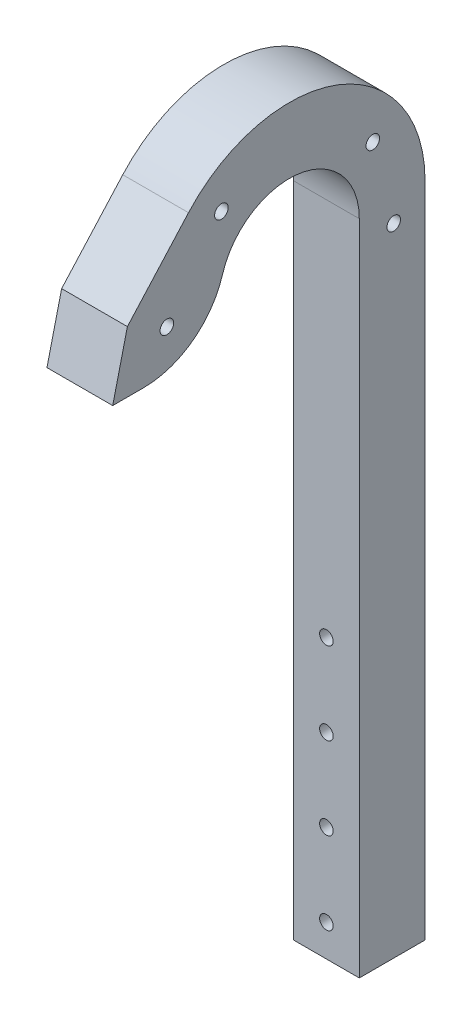
ISO-10303-21;
HEADER;
FILE_DESCRIPTION(('STEP AP214'),'2;1');
FILE_NAME('part.step','',(''),(''),'','','');
FILE_SCHEMA(('AUTOMOTIVE_DESIGN { 1 0 10303 214 1 1 1 1 }'));
ENDSEC;
DATA;
#1=APPLICATION_CONTEXT('core data for automotive mechanical design processes');
#2=APPLICATION_PROTOCOL_DEFINITION('international standard','automotive_design',2000,#1);
#3=PRODUCT_CONTEXT('',#1,'mechanical');
#4=PRODUCT('Part','Part','',(#3));
#5=PRODUCT_RELATED_PRODUCT_CATEGORY('part','',(#4));
#6=PRODUCT_DEFINITION_FORMATION('','',#4);
#7=PRODUCT_DEFINITION_CONTEXT('part definition',#1,'design');
#8=PRODUCT_DEFINITION('design','',#6,#7);
#9=PRODUCT_DEFINITION_SHAPE('','',#8);
#10=(LENGTH_UNIT() NAMED_UNIT(*) SI_UNIT(.MILLI.,.METRE.));
#11=(NAMED_UNIT(*) PLANE_ANGLE_UNIT() SI_UNIT($,.RADIAN.));
#12=(NAMED_UNIT(*) SI_UNIT($,.STERADIAN.) SOLID_ANGLE_UNIT());
#13=UNCERTAINTY_MEASURE_WITH_UNIT(LENGTH_MEASURE(1.E-05),#10,'distance_accuracy_value','');
#14=(GEOMETRIC_REPRESENTATION_CONTEXT(3) GLOBAL_UNCERTAINTY_ASSIGNED_CONTEXT((#13)) GLOBAL_UNIT_ASSIGNED_CONTEXT((#10,
#11,#12)) REPRESENTATION_CONTEXT('',''));
#15=CARTESIAN_POINT('',(0.,0.,0.));
#16=DIRECTION('',(0.,0.,1.));
#17=DIRECTION('',(1.,0.,0.));
#18=AXIS2_PLACEMENT_3D('',#15,#16,#17);
#19=CARTESIAN_POINT('',(20.32,27.4420731203974,138.075603326994));
#20=DIRECTION('',(-1.,0.,0.));
#21=DIRECTION('',(0.,0.,1.));
#22=AXIS2_PLACEMENT_3D('',#19,#20,#21);
#23=CYLINDRICAL_SURFACE('',#22,21.59);
#24=CARTESIAN_POINT('',(0.,27.4420731203974,138.075603326994));
#25=DIRECTION('',(-1.,0.,0.));
#26=DIRECTION('',(0.,0.,-1.));
#27=AXIS2_PLACEMENT_3D('',#24,#25,#26);
#28=CIRCLE('',#27,21.59);
#29=CARTESIAN_POINT('',(0.,33.6387036003068,158.757234565739));
#30=VERTEX_POINT('',#29);
#31=CARTESIAN_POINT('',(0.,27.4420731203974,116.485603326994));
#32=VERTEX_POINT('',#31);
#33=EDGE_CURVE('E135',#30,#32,#28,.T.);
#34=ORIENTED_EDGE('',*,*,#33,.T.);
#35=DIRECTION('',(-1.,0.,0.));
#36=VECTOR('',#35,1.);
#37=CARTESIAN_POINT('',(20.32,27.4420731203974,116.485603326994));
#38=LINE('',#37,#36);
#39=CARTESIAN_POINT('',(20.32,27.4420731203974,116.485603326994));
#40=VERTEX_POINT('',#39);
#41=EDGE_CURVE('E11',#40,#32,#38,.T.);
#42=ORIENTED_EDGE('',*,*,#41,.F.);
#43=CARTESIAN_POINT('',(20.32,27.4420731203974,138.075603326994));
#44=DIRECTION('',(-1.,0.,0.));
#45=DIRECTION('',(0.,0.,-1.));
#46=AXIS2_PLACEMENT_3D('',#43,#44,#45);
#47=CIRCLE('',#46,21.59);
#48=CARTESIAN_POINT('',(20.32,33.6387036003068,158.757234565739));
#49=VERTEX_POINT('',#48);
#50=EDGE_CURVE('E152',#49,#40,#47,.T.);
#51=ORIENTED_EDGE('',*,*,#50,.F.);
#52=DIRECTION('',(-1.,0.,0.));
#53=VECTOR('',#52,1.);
#54=CARTESIAN_POINT('',(20.32,33.6387036003068,158.757234565739));
#55=LINE('',#54,#53);
#56=EDGE_CURVE('E131',#49,#30,#55,.T.);
#57=ORIENTED_EDGE('',*,*,#56,.T.);
#58=EDGE_LOOP('',(#34,#42,#51,#57));
#59=FACE_BOUND('',#58,.T.);
#60=ADVANCED_FACE('F33',(#59),#23,.F.);
#61=CARTESIAN_POINT('',(20.32,-175.757926879603,116.485603326994));
#62=DIRECTION('',(0.,0.,-1.));
#63=DIRECTION('',(-1.,0.,0.));
#64=AXIS2_PLACEMENT_3D('',#61,#62,#63);
#65=PLANE('',#64);
#66=CARTESIAN_POINT('',(10.1600000000002,-89.6972359977407,116.485603326994));
#67=DIRECTION('',(0.,0.,1.));
#68=DIRECTION('',(1.,0.,0.));
#69=AXIS2_PLACEMENT_3D('',#66,#67,#68);
#70=CIRCLE('',#69,2.09549999999999);
#71=CARTESIAN_POINT('',(12.2555000000001,-89.6972359977407,116.485603326994));
#72=VERTEX_POINT('',#71);
#73=EDGE_CURVE('E213',#72,#72,#70,.T.);
#74=ORIENTED_EDGE('',*,*,#73,.F.);
#75=EDGE_LOOP('',(#74));
#76=FACE_BOUND('',#75,.T.);
#77=CARTESIAN_POINT('',(10.1600000000002,-115.097235997741,116.485603326994));
#78=DIRECTION('',(0.,0.,1.));
#79=DIRECTION('',(1.,0.,0.));
#80=AXIS2_PLACEMENT_3D('',#77,#78,#79);
#81=CIRCLE('',#80,2.09549999999999);
#82=CARTESIAN_POINT('',(12.2555000000002,-115.097235997741,116.485603326994));
#83=VERTEX_POINT('',#82);
#84=EDGE_CURVE('E207',#83,#83,#81,.T.);
#85=ORIENTED_EDGE('',*,*,#84,.F.);
#86=EDGE_LOOP('',(#85));
#87=FACE_BOUND('',#86,.T.);
#88=CARTESIAN_POINT('',(10.1600000000002,-140.497235997741,116.485603326994));
#89=DIRECTION('',(0.,0.,1.));
#90=DIRECTION('',(1.,0.,0.));
#91=AXIS2_PLACEMENT_3D('',#88,#89,#90);
#92=CIRCLE('',#91,2.09549999999999);
#93=CARTESIAN_POINT('',(12.2555000000002,-140.497235997741,116.485603326994));
#94=VERTEX_POINT('',#93);
#95=EDGE_CURVE('E201',#94,#94,#92,.T.);
#96=ORIENTED_EDGE('',*,*,#95,.F.);
#97=EDGE_LOOP('',(#96));
#98=FACE_BOUND('',#97,.T.);
#99=CARTESIAN_POINT('',(10.1600000000002,-165.897235997741,116.485603326994));
#100=DIRECTION('',(0.,0.,1.));
#101=DIRECTION('',(1.,0.,0.));
#102=AXIS2_PLACEMENT_3D('',#99,#100,#101);
#103=CIRCLE('',#102,2.09549999999999);
#104=CARTESIAN_POINT('',(12.2555000000002,-165.897235997741,116.485603326994));
#105=VERTEX_POINT('',#104);
#106=EDGE_CURVE('E195',#105,#105,#103,.T.);
#107=ORIENTED_EDGE('',*,*,#106,.F.);
#108=EDGE_LOOP('',(#107));
#109=FACE_BOUND('',#108,.T.);
#110=DIRECTION('',(0.,-1.,0.));
#111=VECTOR('',#110,1.);
#112=CARTESIAN_POINT('',(0.,-175.757926879603,116.485603326994));
#113=LINE('',#112,#111);
#114=CARTESIAN_POINT('',(0.,-175.757926879603,116.485603326994));
#115=VERTEX_POINT('',#114);
#116=EDGE_CURVE('E138',#32,#115,#113,.T.);
#117=ORIENTED_EDGE('',*,*,#116,.T.);
#118=DIRECTION('',(-1.,0.,0.));
#119=VECTOR('',#118,1.);
#120=CARTESIAN_POINT('',(20.32,-175.757926879603,116.485603326994));
#121=LINE('',#120,#119);
#122=CARTESIAN_POINT('',(20.32,-175.757926879603,116.485603326994));
#123=VERTEX_POINT('',#122);
#124=EDGE_CURVE('E41',#123,#115,#121,.T.);
#125=ORIENTED_EDGE('',*,*,#124,.F.);
#126=DIRECTION('',(0.,-1.,0.));
#127=VECTOR('',#126,1.);
#128=CARTESIAN_POINT('',(20.32,-175.757926879603,116.485603326994));
#129=LINE('',#128,#127);
#130=EDGE_CURVE('E95',#40,#123,#129,.T.);
#131=ORIENTED_EDGE('',*,*,#130,.F.);
#132=ORIENTED_EDGE('',*,*,#41,.T.);
#133=EDGE_LOOP('',(#117,#125,#131,#132));
#134=FACE_BOUND('',#133,.T.);
#135=ADVANCED_FACE('F255',(#76,#87,#98,#109,#134),#65,.F.);
#136=CARTESIAN_POINT('',(20.32,-175.757926879603,96.1656033269935));
#137=DIRECTION('',(0.,1.,0.));
#138=DIRECTION('',(0.,0.,1.));
#139=AXIS2_PLACEMENT_3D('',#136,#137,#138);
#140=PLANE('',#139);
#141=DIRECTION('',(0.,0.,-1.));
#142=VECTOR('',#141,1.);
#143=CARTESIAN_POINT('',(0.,-175.757926879603,96.1656033269935));
#144=LINE('',#143,#142);
#145=CARTESIAN_POINT('',(0.,-175.757926879603,96.1656033269935));
#146=VERTEX_POINT('',#145);
#147=EDGE_CURVE('E141',#115,#146,#144,.T.);
#148=ORIENTED_EDGE('',*,*,#147,.T.);
#149=DIRECTION('',(-1.,0.,0.));
#150=VECTOR('',#149,1.);
#151=CARTESIAN_POINT('',(20.32,-175.757926879603,96.1656033269935));
#152=LINE('',#151,#150);
#153=CARTESIAN_POINT('',(20.32,-175.757926879603,96.1656033269935));
#154=VERTEX_POINT('',#153);
#155=EDGE_CURVE('E162',#154,#146,#152,.T.);
#156=ORIENTED_EDGE('',*,*,#155,.F.);
#157=DIRECTION('',(0.,0.,-1.));
#158=VECTOR('',#157,1.);
#159=CARTESIAN_POINT('',(20.32,-175.757926879603,96.1656033269935));
#160=LINE('',#159,#158);
#161=EDGE_CURVE('E170',#123,#154,#160,.T.);
#162=ORIENTED_EDGE('',*,*,#161,.F.);
#163=ORIENTED_EDGE('',*,*,#124,.T.);
#164=EDGE_LOOP('',(#148,#156,#162,#163));
#165=FACE_BOUND('',#164,.T.);
#166=ADVANCED_FACE('F168',(#165),#140,.F.);
#167=CARTESIAN_POINT('',(20.32,-175.757926879603,96.1656033269935));
#168=DIRECTION('',(0.,0.,1.));
#169=DIRECTION('',(0.,-1.,0.));
#170=AXIS2_PLACEMENT_3D('',#167,#168,#169);
#171=PLANE('',#170);
#172=CARTESIAN_POINT('',(10.1600000000002,-89.6972359977407,96.1656033269935));
#173=DIRECTION('',(0.,0.,1.));
#174=DIRECTION('',(1.,0.,0.));
#175=AXIS2_PLACEMENT_3D('',#172,#173,#174);
#176=CIRCLE('',#175,2.0955);
#177=CARTESIAN_POINT('',(12.2555000000001,-89.6972359977407,96.1656033269935));
#178=VERTEX_POINT('',#177);
#179=EDGE_CURVE('E210',#178,#178,#176,.T.);
#180=ORIENTED_EDGE('',*,*,#179,.T.);
#181=EDGE_LOOP('',(#180));
#182=FACE_BOUND('',#181,.T.);
#183=CARTESIAN_POINT('',(10.1600000000002,-115.097235997741,96.1656033269935));
#184=DIRECTION('',(0.,0.,1.));
#185=DIRECTION('',(1.,0.,0.));
#186=AXIS2_PLACEMENT_3D('',#183,#184,#185);
#187=CIRCLE('',#186,2.0955);
#188=CARTESIAN_POINT('',(12.2555000000002,-115.097235997741,96.1656033269935));
#189=VERTEX_POINT('',#188);
#190=EDGE_CURVE('E204',#189,#189,#187,.T.);
#191=ORIENTED_EDGE('',*,*,#190,.T.);
#192=EDGE_LOOP('',(#191));
#193=FACE_BOUND('',#192,.T.);
#194=CARTESIAN_POINT('',(10.1600000000002,-140.497235997741,96.1656033269935));
#195=DIRECTION('',(0.,0.,1.));
#196=DIRECTION('',(1.,0.,0.));
#197=AXIS2_PLACEMENT_3D('',#194,#195,#196);
#198=CIRCLE('',#197,2.0955);
#199=CARTESIAN_POINT('',(12.2555000000002,-140.497235997741,96.1656033269935));
#200=VERTEX_POINT('',#199);
#201=EDGE_CURVE('E198',#200,#200,#198,.T.);
#202=ORIENTED_EDGE('',*,*,#201,.T.);
#203=EDGE_LOOP('',(#202));
#204=FACE_BOUND('',#203,.T.);
#205=CARTESIAN_POINT('',(10.1600000000002,-165.897235997741,96.1656033269935));
#206=DIRECTION('',(0.,0.,1.));
#207=DIRECTION('',(1.,0.,0.));
#208=AXIS2_PLACEMENT_3D('',#205,#206,#207);
#209=CIRCLE('',#208,2.0955);
#210=CARTESIAN_POINT('',(12.2555000000002,-165.897235997741,96.1656033269935));
#211=VERTEX_POINT('',#210);
#212=EDGE_CURVE('E139',#211,#211,#209,.T.);
#213=ORIENTED_EDGE('',*,*,#212,.T.);
#214=EDGE_LOOP('',(#213));
#215=FACE_BOUND('',#214,.T.);
#216=DIRECTION('',(0.,1.,0.));
#217=VECTOR('',#216,1.);
#218=CARTESIAN_POINT('',(0.,-175.757926879603,96.1656033269935));
#219=LINE('',#218,#217);
#220=CARTESIAN_POINT('',(0.,27.4420731203974,96.1656033269935));
#221=VERTEX_POINT('',#220);
#222=EDGE_CURVE('E143',#146,#221,#219,.T.);
#223=ORIENTED_EDGE('',*,*,#222,.T.);
#224=DIRECTION('',(-1.,0.,0.));
#225=VECTOR('',#224,1.);
#226=CARTESIAN_POINT('',(20.32,27.4420731203974,96.1656033269935));
#227=LINE('',#226,#225);
#228=CARTESIAN_POINT('',(20.32,27.4420731203974,96.1656033269935));
#229=VERTEX_POINT('',#228);
#230=EDGE_CURVE('E159',#229,#221,#227,.T.);
#231=ORIENTED_EDGE('',*,*,#230,.F.);
#232=DIRECTION('',(0.,1.,0.));
#233=VECTOR('',#232,1.);
#234=CARTESIAN_POINT('',(20.32,-175.757926879603,96.1656033269935));
#235=LINE('',#234,#233);
#236=EDGE_CURVE('E186',#154,#229,#235,.T.);
#237=ORIENTED_EDGE('',*,*,#236,.F.);
#238=ORIENTED_EDGE('',*,*,#155,.T.);
#239=EDGE_LOOP('',(#223,#231,#237,#238));
#240=FACE_BOUND('',#239,.T.);
#241=ADVANCED_FACE('F179',(#182,#193,#204,#215,#240),#171,.F.);
#242=CARTESIAN_POINT('',(20.32,27.4420731203974,138.075603326994));
#243=DIRECTION('',(-1.,0.,0.));
#244=DIRECTION('',(0.,0.,1.));
#245=AXIS2_PLACEMENT_3D('',#242,#243,#244);
#246=CYLINDRICAL_SURFACE('',#245,41.91);
#247=CARTESIAN_POINT('',(0.,27.4420731203974,138.075603326994));
#248=DIRECTION('',(1.,0.,0.));
#249=DIRECTION('',(0.,0.,-1.));
#250=AXIS2_PLACEMENT_3D('',#247,#248,#249);
#251=CIRCLE('',#250,41.91);
#252=CARTESIAN_POINT('',(0.,55.4397133095497,169.261822139776));
#253=VERTEX_POINT('',#252);
#254=EDGE_CURVE('E145',#221,#253,#251,.T.);
#255=ORIENTED_EDGE('',*,*,#254,.T.);
#256=DIRECTION('',(-1.,0.,0.));
#257=VECTOR('',#256,1.);
#258=CARTESIAN_POINT('',(20.32,55.4397133095497,169.261822139776));
#259=LINE('',#258,#257);
#260=CARTESIAN_POINT('',(20.32,55.4397133095497,169.261822139776));
#261=VERTEX_POINT('',#260);
#262=EDGE_CURVE('E156',#261,#253,#259,.T.);
#263=ORIENTED_EDGE('',*,*,#262,.F.);
#264=CARTESIAN_POINT('',(20.32,27.4420731203974,138.075603326994));
#265=DIRECTION('',(1.,0.,0.));
#266=DIRECTION('',(0.,0.,-1.));
#267=AXIS2_PLACEMENT_3D('',#264,#265,#266);
#268=CIRCLE('',#267,41.91);
#269=EDGE_CURVE('E185',#229,#261,#268,.T.);
#270=ORIENTED_EDGE('',*,*,#269,.F.);
#271=ORIENTED_EDGE('',*,*,#230,.T.);
#272=EDGE_LOOP('',(#255,#263,#270,#271));
#273=FACE_BOUND('',#272,.T.);
#274=ADVANCED_FACE('F183',(#273),#246,.T.);
#275=CARTESIAN_POINT('',(20.32,55.4397133095497,169.261822139776));
#276=DIRECTION('',(0.,-0.668041999263954,-0.74412356985881));
#277=DIRECTION('',(0.,0.74412356985881,-0.668041999263954));
#278=AXIS2_PLACEMENT_3D('',#275,#276,#277);
#279=PLANE('',#278);
#280=DIRECTION('',(0.,-0.74412356985881,0.668041999263954));
#281=VECTOR('',#280,1.);
#282=CARTESIAN_POINT('',(0.,55.4397133095497,169.261822139776));
#283=LINE('',#282,#281);
#284=CARTESIAN_POINT('',(0.,34.4037686685624,188.146984609549));
#285=VERTEX_POINT('',#284);
#286=EDGE_CURVE('E147',#253,#285,#283,.T.);
#287=ORIENTED_EDGE('',*,*,#286,.T.);
#288=DIRECTION('',(-1.,0.,0.));
#289=VECTOR('',#288,1.);
#290=CARTESIAN_POINT('',(20.32,34.4037686685624,188.146984609549));
#291=LINE('',#290,#289);
#292=CARTESIAN_POINT('',(20.32,34.4037686685624,188.146984609549));
#293=VERTEX_POINT('',#292);
#294=EDGE_CURVE('E126',#293,#285,#291,.T.);
#295=ORIENTED_EDGE('',*,*,#294,.F.);
#296=DIRECTION('',(0.,-0.74412356985881,0.668041999263954));
#297=VECTOR('',#296,1.);
#298=CARTESIAN_POINT('',(20.32,55.4397133095497,169.261822139776));
#299=LINE('',#298,#297);
#300=EDGE_CURVE('E117',#261,#293,#299,.T.);
#301=ORIENTED_EDGE('',*,*,#300,.F.);
#302=ORIENTED_EDGE('',*,*,#262,.T.);
#303=EDGE_LOOP('',(#287,#295,#301,#302));
#304=FACE_BOUND('',#303,.T.);
#305=ADVANCED_FACE('F264',(#304),#279,.F.);
#306=CARTESIAN_POINT('',(20.32,15.5288571060826,192.685603326994));
#307=DIRECTION('',(0.,-0.233793752789297,-0.972286213600037));
#308=DIRECTION('',(0.,0.972286213600037,-0.233793752789297));
#309=AXIS2_PLACEMENT_3D('',#306,#307,#308);
#310=PLANE('',#309);
#311=DIRECTION('',(0.,-0.972286213600037,0.233793752789297));
#312=VECTOR('',#311,1.);
#313=CARTESIAN_POINT('',(0.,15.5288571060826,192.685603326994));
#314=LINE('',#313,#312);
#315=CARTESIAN_POINT('',(0.,15.5288571060826,192.685603326994));
#316=VERTEX_POINT('',#315);
#317=EDGE_CURVE('E125',#285,#316,#314,.T.);
#318=ORIENTED_EDGE('',*,*,#317,.T.);
#319=DIRECTION('',(-1.,0.,0.));
#320=VECTOR('',#319,1.);
#321=CARTESIAN_POINT('',(20.32,15.5288571060826,192.685603326994));
#322=LINE('',#321,#320);
#323=CARTESIAN_POINT('',(20.32,15.5288571060826,192.685603326994));
#324=VERTEX_POINT('',#323);
#325=EDGE_CURVE('E122',#324,#316,#322,.T.);
#326=ORIENTED_EDGE('',*,*,#325,.F.);
#327=DIRECTION('',(0.,-0.972286213600037,0.233793752789297));
#328=VECTOR('',#327,1.);
#329=CARTESIAN_POINT('',(20.32,15.5288571060826,192.685603326994));
#330=LINE('',#329,#328);
#331=EDGE_CURVE('E111',#293,#324,#330,.T.);
#332=ORIENTED_EDGE('',*,*,#331,.F.);
#333=ORIENTED_EDGE('',*,*,#294,.T.);
#334=EDGE_LOOP('',(#318,#326,#332,#333));
#335=FACE_BOUND('',#334,.T.);
#336=ADVANCED_FACE('F123',(#335),#310,.F.);
#337=CARTESIAN_POINT('',(20.32,15.5288571060826,192.685603326994));
#338=DIRECTION('',(0.,1.,0.));
#339=DIRECTION('',(0.,0.,1.));
#340=AXIS2_PLACEMENT_3D('',#337,#338,#339);
#341=PLANE('',#340);
#342=DIRECTION('',(0.,0.,-1.));
#343=VECTOR('',#342,1.);
#344=CARTESIAN_POINT('',(0.,15.5288571060826,192.685603326994));
#345=LINE('',#344,#343);
#346=CARTESIAN_POINT('',(0.,15.5288571060826,183.088565434852));
#347=VERTEX_POINT('',#346);
#348=EDGE_CURVE('E81',#316,#347,#345,.T.);
#349=ORIENTED_EDGE('',*,*,#348,.T.);
#350=DIRECTION('',(-1.,0.,0.));
#351=VECTOR('',#350,1.);
#352=CARTESIAN_POINT('',(20.32,15.5288571060826,183.088565434852));
#353=LINE('',#352,#351);
#354=CARTESIAN_POINT('',(20.32,15.5288571060826,183.088565434852));
#355=VERTEX_POINT('',#354);
#356=EDGE_CURVE('E127',#355,#347,#353,.T.);
#357=ORIENTED_EDGE('',*,*,#356,.F.);
#358=DIRECTION('',(0.,0.,-1.));
#359=VECTOR('',#358,1.);
#360=CARTESIAN_POINT('',(20.32,15.5288571060826,192.685603326994));
#361=LINE('',#360,#359);
#362=EDGE_CURVE('E115',#324,#355,#361,.T.);
#363=ORIENTED_EDGE('',*,*,#362,.F.);
#364=ORIENTED_EDGE('',*,*,#325,.T.);
#365=EDGE_LOOP('',(#349,#357,#363,#364));
#366=FACE_BOUND('',#365,.T.);
#367=ADVANCED_FACE('F129',(#366),#341,.F.);
#368=CARTESIAN_POINT('',(20.32,40.9288571060826,183.088565434852));
#369=DIRECTION('',(-1.,0.,0.));
#370=DIRECTION('',(0.,0.,1.));
#371=AXIS2_PLACEMENT_3D('',#368,#369,#370);
#372=CYLINDRICAL_SURFACE('',#371,25.4);
#373=CARTESIAN_POINT('',(0.,40.9288571060826,183.088565434852));
#374=DIRECTION('',(1.,0.,0.));
#375=DIRECTION('',(0.,0.,-1.));
#376=AXIS2_PLACEMENT_3D('',#373,#374,#375);
#377=CIRCLE('',#376,25.4);
#378=EDGE_CURVE('E87',#347,#30,#377,.T.);
#379=ORIENTED_EDGE('',*,*,#378,.T.);
#380=ORIENTED_EDGE('',*,*,#56,.F.);
#381=CARTESIAN_POINT('',(20.32,40.9288571060826,183.088565434852));
#382=DIRECTION('',(1.,0.,0.));
#383=DIRECTION('',(0.,0.,-1.));
#384=AXIS2_PLACEMENT_3D('',#381,#382,#383);
#385=CIRCLE('',#384,25.4);
#386=EDGE_CURVE('E49',#355,#49,#385,.T.);
#387=ORIENTED_EDGE('',*,*,#386,.F.);
#388=ORIENTED_EDGE('',*,*,#356,.T.);
#389=EDGE_LOOP('',(#379,#380,#387,#388));
#390=FACE_BOUND('',#389,.T.);
#391=ADVANCED_FACE('F311',(#390),#372,.T.);
#392=CARTESIAN_POINT('',(20.32,27.4420731203974,138.075603326994));
#393=DIRECTION('',(1.,0.,0.));
#394=DIRECTION('',(0.,0.,-1.));
#395=AXIS2_PLACEMENT_3D('',#392,#393,#394);
#396=PLANE('',#395);
#397=CARTESIAN_POINT('',(20.32,28.2265622554441,175.949281774091));
#398=DIRECTION('',(1.,0.,0.));
#399=DIRECTION('',(0.,0.,-1.));
#400=AXIS2_PLACEMENT_3D('',#397,#398,#399);
#401=CIRCLE('',#400,2.09549999999999);
#402=CARTESIAN_POINT('',(20.32,28.2265622554441,173.853781774091));
#403=VERTEX_POINT('',#402);
#404=EDGE_CURVE('E216',#403,#403,#401,.T.);
#405=ORIENTED_EDGE('',*,*,#404,.F.);
#406=EDGE_LOOP('',(#405));
#407=FACE_BOUND('',#406,.T.);
#408=CARTESIAN_POINT('',(20.32,45.8716788063391,112.311952600119));
#409=DIRECTION('',(1.,0.,0.));
#410=DIRECTION('',(0.,0.,-1.));
#411=AXIS2_PLACEMENT_3D('',#408,#409,#410);
#412=CIRCLE('',#411,2.09549999999999);
#413=CARTESIAN_POINT('',(20.32,45.8716788063391,110.216452600119));
#414=VERTEX_POINT('',#413);
#415=EDGE_CURVE('E219',#414,#414,#412,.T.);
#416=ORIENTED_EDGE('',*,*,#415,.F.);
#417=EDGE_LOOP('',(#416));
#418=FACE_BOUND('',#417,.T.);
#419=CARTESIAN_POINT('',(20.32,50.6839126340779,159.099223614639));
#420=DIRECTION('',(1.,0.,0.));
#421=DIRECTION('',(0.,0.,-1.));
#422=AXIS2_PLACEMENT_3D('',#419,#420,#421);
#423=CIRCLE('',#422,2.09549999999999);
#424=CARTESIAN_POINT('',(20.32,50.6839126340779,157.003723614639));
#425=VERTEX_POINT('',#424);
#426=EDGE_CURVE('E222',#425,#425,#423,.T.);
#427=ORIENTED_EDGE('',*,*,#426,.F.);
#428=EDGE_LOOP('',(#427));
#429=FACE_BOUND('',#428,.T.);
#430=CARTESIAN_POINT('',(20.32,20.8650714191378,105.851443143401));
#431=DIRECTION('',(1.,0.,0.));
#432=DIRECTION('',(0.,0.,-1.));
#433=AXIS2_PLACEMENT_3D('',#430,#431,#432);
#434=CIRCLE('',#433,2.09549999999999);
#435=CARTESIAN_POINT('',(20.32,20.8650714191378,103.755943143401));
#436=VERTEX_POINT('',#435);
#437=EDGE_CURVE('E225',#436,#436,#434,.T.);
#438=ORIENTED_EDGE('',*,*,#437,.F.);
#439=EDGE_LOOP('',(#438));
#440=FACE_BOUND('',#439,.T.);
#441=ORIENTED_EDGE('',*,*,#50,.T.);
#442=ORIENTED_EDGE('',*,*,#130,.T.);
#443=ORIENTED_EDGE('',*,*,#161,.T.);
#444=ORIENTED_EDGE('',*,*,#236,.T.);
#445=ORIENTED_EDGE('',*,*,#269,.T.);
#446=ORIENTED_EDGE('',*,*,#300,.T.);
#447=ORIENTED_EDGE('',*,*,#331,.T.);
#448=ORIENTED_EDGE('',*,*,#362,.T.);
#449=ORIENTED_EDGE('',*,*,#386,.T.);
#450=EDGE_LOOP('',(#441,#442,#443,#444,#445,#446,#447,#448,#449));
#451=FACE_BOUND('',#450,.T.);
#452=ADVANCED_FACE('F113',(#407,#418,#429,#440,#451),#396,.T.);
#453=CARTESIAN_POINT('',(0.,27.4420731203974,138.075603326994));
#454=DIRECTION('',(1.,0.,0.));
#455=DIRECTION('',(0.,0.,-1.));
#456=AXIS2_PLACEMENT_3D('',#453,#454,#455);
#457=PLANE('',#456);
#458=CARTESIAN_POINT('',(0.,28.2265622554441,175.949281774091));
#459=DIRECTION('',(1.,0.,0.));
#460=DIRECTION('',(0.,0.,-1.));
#461=AXIS2_PLACEMENT_3D('',#458,#459,#460);
#462=CIRCLE('',#461,2.09549999999999);
#463=CARTESIAN_POINT('',(0.,28.2265622554441,173.853781774091));
#464=VERTEX_POINT('',#463);
#465=EDGE_CURVE('E228',#464,#464,#462,.T.);
#466=ORIENTED_EDGE('',*,*,#465,.T.);
#467=EDGE_LOOP('',(#466));
#468=FACE_BOUND('',#467,.T.);
#469=CARTESIAN_POINT('',(0.,45.8716788063391,112.311952600119));
#470=DIRECTION('',(1.,0.,0.));
#471=DIRECTION('',(0.,0.,-1.));
#472=AXIS2_PLACEMENT_3D('',#469,#470,#471);
#473=CIRCLE('',#472,2.09549999999999);
#474=CARTESIAN_POINT('',(0.,45.8716788063391,110.216452600119));
#475=VERTEX_POINT('',#474);
#476=EDGE_CURVE('E235',#475,#475,#473,.T.);
#477=ORIENTED_EDGE('',*,*,#476,.T.);
#478=EDGE_LOOP('',(#477));
#479=FACE_BOUND('',#478,.T.);
#480=CARTESIAN_POINT('',(0.,50.6839126340779,159.099223614639));
#481=DIRECTION('',(1.,0.,0.));
#482=DIRECTION('',(0.,0.,-1.));
#483=AXIS2_PLACEMENT_3D('',#480,#481,#482);
#484=CIRCLE('',#483,2.09549999999999);
#485=CARTESIAN_POINT('',(0.,50.6839126340779,157.003723614639));
#486=VERTEX_POINT('',#485);
#487=EDGE_CURVE('E232',#486,#486,#484,.T.);
#488=ORIENTED_EDGE('',*,*,#487,.T.);
#489=EDGE_LOOP('',(#488));
#490=FACE_BOUND('',#489,.T.);
#491=CARTESIAN_POINT('',(0.,20.8650714191378,105.851443143401));
#492=DIRECTION('',(1.,0.,0.));
#493=DIRECTION('',(0.,0.,-1.));
#494=AXIS2_PLACEMENT_3D('',#491,#492,#493);
#495=CIRCLE('',#494,2.09549999999999);
#496=CARTESIAN_POINT('',(0.,20.8650714191378,103.755943143401));
#497=VERTEX_POINT('',#496);
#498=EDGE_CURVE('E229',#497,#497,#495,.T.);
#499=ORIENTED_EDGE('',*,*,#498,.T.);
#500=EDGE_LOOP('',(#499));
#501=FACE_BOUND('',#500,.T.);
#502=ORIENTED_EDGE('',*,*,#33,.F.);
#503=ORIENTED_EDGE('',*,*,#378,.F.);
#504=ORIENTED_EDGE('',*,*,#348,.F.);
#505=ORIENTED_EDGE('',*,*,#317,.F.);
#506=ORIENTED_EDGE('',*,*,#286,.F.);
#507=ORIENTED_EDGE('',*,*,#254,.F.);
#508=ORIENTED_EDGE('',*,*,#222,.F.);
#509=ORIENTED_EDGE('',*,*,#147,.F.);
#510=ORIENTED_EDGE('',*,*,#116,.F.);
#511=EDGE_LOOP('',(#502,#503,#504,#505,#506,#507,#508,#509,#510));
#512=FACE_BOUND('',#511,.T.);
#513=ADVANCED_FACE('F174',(#468,#479,#490,#501,#512),#457,.F.);
#514=CARTESIAN_POINT('',(10.1600000000002,-165.897235997741,116.485603326994));
#515=DIRECTION('',(0.,0.,1.));
#516=DIRECTION('',(1.,0.,0.));
#517=AXIS2_PLACEMENT_3D('',#514,#515,#516);
#518=CYLINDRICAL_SURFACE('',#517,2.09549999999999);
#519=ORIENTED_EDGE('',*,*,#212,.F.);
#520=EDGE_LOOP('',(#519));
#521=FACE_BOUND('',#520,.T.);
#522=ORIENTED_EDGE('',*,*,#106,.T.);
#523=EDGE_LOOP('',(#522));
#524=FACE_BOUND('',#523,.T.);
#525=ADVANCED_FACE('F346',(#521,#524),#518,.F.);
#526=CARTESIAN_POINT('',(10.1600000000002,-140.497235997741,116.485603326994));
#527=DIRECTION('',(0.,0.,1.));
#528=DIRECTION('',(1.,0.,0.));
#529=AXIS2_PLACEMENT_3D('',#526,#527,#528);
#530=CYLINDRICAL_SURFACE('',#529,2.09549999999999);
#531=ORIENTED_EDGE('',*,*,#201,.F.);
#532=EDGE_LOOP('',(#531));
#533=FACE_BOUND('',#532,.T.);
#534=ORIENTED_EDGE('',*,*,#95,.T.);
#535=EDGE_LOOP('',(#534));
#536=FACE_BOUND('',#535,.T.);
#537=ADVANCED_FACE('F353',(#533,#536),#530,.F.);
#538=CARTESIAN_POINT('',(10.1600000000002,-115.097235997741,116.485603326994));
#539=DIRECTION('',(0.,0.,1.));
#540=DIRECTION('',(1.,0.,0.));
#541=AXIS2_PLACEMENT_3D('',#538,#539,#540);
#542=CYLINDRICAL_SURFACE('',#541,2.09549999999999);
#543=ORIENTED_EDGE('',*,*,#190,.F.);
#544=EDGE_LOOP('',(#543));
#545=FACE_BOUND('',#544,.T.);
#546=ORIENTED_EDGE('',*,*,#84,.T.);
#547=EDGE_LOOP('',(#546));
#548=FACE_BOUND('',#547,.T.);
#549=ADVANCED_FACE('F361',(#545,#548),#542,.F.);
#550=CARTESIAN_POINT('',(10.1600000000002,-89.6972359977407,116.485603326994));
#551=DIRECTION('',(0.,0.,1.));
#552=DIRECTION('',(1.,0.,0.));
#553=AXIS2_PLACEMENT_3D('',#550,#551,#552);
#554=CYLINDRICAL_SURFACE('',#553,2.09549999999999);
#555=ORIENTED_EDGE('',*,*,#179,.F.);
#556=EDGE_LOOP('',(#555));
#557=FACE_BOUND('',#556,.T.);
#558=ORIENTED_EDGE('',*,*,#73,.T.);
#559=EDGE_LOOP('',(#558));
#560=FACE_BOUND('',#559,.T.);
#561=ADVANCED_FACE('F369',(#557,#560),#554,.F.);
#562=CARTESIAN_POINT('',(0.,20.8650714191378,105.851443143401));
#563=DIRECTION('',(1.,0.,0.));
#564=DIRECTION('',(0.,0.,-1.));
#565=AXIS2_PLACEMENT_3D('',#562,#563,#564);
#566=CYLINDRICAL_SURFACE('',#565,2.09549999999999);
#567=ORIENTED_EDGE('',*,*,#437,.T.);
#568=EDGE_LOOP('',(#567));
#569=FACE_BOUND('',#568,.T.);
#570=ORIENTED_EDGE('',*,*,#498,.F.);
#571=EDGE_LOOP('',(#570));
#572=FACE_BOUND('',#571,.T.);
#573=ADVANCED_FACE('F376',(#569,#572),#566,.F.);
#574=CARTESIAN_POINT('',(0.,50.6839126340779,159.099223614639));
#575=DIRECTION('',(1.,0.,0.));
#576=DIRECTION('',(0.,0.,-1.));
#577=AXIS2_PLACEMENT_3D('',#574,#575,#576);
#578=CYLINDRICAL_SURFACE('',#577,2.09549999999999);
#579=ORIENTED_EDGE('',*,*,#426,.T.);
#580=EDGE_LOOP('',(#579));
#581=FACE_BOUND('',#580,.T.);
#582=ORIENTED_EDGE('',*,*,#487,.F.);
#583=EDGE_LOOP('',(#582));
#584=FACE_BOUND('',#583,.T.);
#585=ADVANCED_FACE('F251',(#581,#584),#578,.F.);
#586=CARTESIAN_POINT('',(0.,45.8716788063391,112.311952600119));
#587=DIRECTION('',(1.,0.,0.));
#588=DIRECTION('',(0.,0.,-1.));
#589=AXIS2_PLACEMENT_3D('',#586,#587,#588);
#590=CYLINDRICAL_SURFACE('',#589,2.09549999999999);
#591=ORIENTED_EDGE('',*,*,#415,.T.);
#592=EDGE_LOOP('',(#591));
#593=FACE_BOUND('',#592,.T.);
#594=ORIENTED_EDGE('',*,*,#476,.F.);
#595=EDGE_LOOP('',(#594));
#596=FACE_BOUND('',#595,.T.);
#597=ADVANCED_FACE('F245',(#593,#596),#590,.F.);
#598=CARTESIAN_POINT('',(0.,28.2265622554441,175.949281774091));
#599=DIRECTION('',(1.,0.,0.));
#600=DIRECTION('',(0.,0.,-1.));
#601=AXIS2_PLACEMENT_3D('',#598,#599,#600);
#602=CYLINDRICAL_SURFACE('',#601,2.09549999999999);
#603=ORIENTED_EDGE('',*,*,#404,.T.);
#604=EDGE_LOOP('',(#603));
#605=FACE_BOUND('',#604,.T.);
#606=ORIENTED_EDGE('',*,*,#465,.F.);
#607=EDGE_LOOP('',(#606));
#608=FACE_BOUND('',#607,.T.);
#609=ADVANCED_FACE('F243',(#605,#608),#602,.F.);
#610=CLOSED_SHELL('',(#60,#135,#166,#241,#274,#305,#336,#367,#391,#452,#513,#525,#537,#549,#561,
#573,#585,#597,#609));
#611=MANIFOLD_SOLID_BREP('B2',#610);
#612=ADVANCED_BREP_SHAPE_REPRESENTATION('',(#18,#611),#14);
#613=SHAPE_DEFINITION_REPRESENTATION(#9,#612);
ENDSEC;
END-ISO-10303-21;
